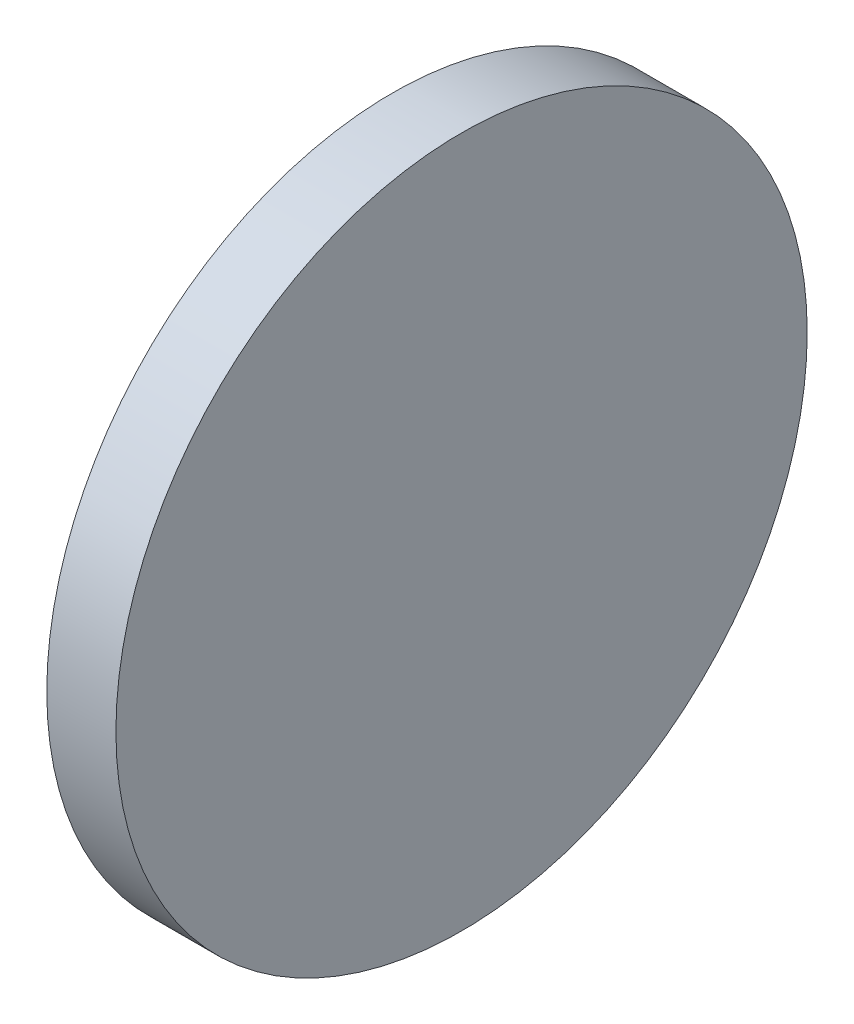
ISO-10303-21;
HEADER;
FILE_DESCRIPTION(('STEP AP214'),'2;1');
FILE_NAME('part.step','',(''),(''),'','','');
FILE_SCHEMA(('AUTOMOTIVE_DESIGN { 1 0 10303 214 1 1 1 1 }'));
ENDSEC;
DATA;
#1=APPLICATION_CONTEXT('core data for automotive mechanical design processes');
#2=APPLICATION_PROTOCOL_DEFINITION('international standard','automotive_design',2000,#1);
#3=PRODUCT_CONTEXT('',#1,'mechanical');
#4=PRODUCT('Part','Part','',(#3));
#5=PRODUCT_RELATED_PRODUCT_CATEGORY('part','',(#4));
#6=PRODUCT_DEFINITION_FORMATION('','',#4);
#7=PRODUCT_DEFINITION_CONTEXT('part definition',#1,'design');
#8=PRODUCT_DEFINITION('design','',#6,#7);
#9=PRODUCT_DEFINITION_SHAPE('','',#8);
#10=(LENGTH_UNIT() NAMED_UNIT(*) SI_UNIT(.MILLI.,.METRE.));
#11=(NAMED_UNIT(*) PLANE_ANGLE_UNIT() SI_UNIT($,.RADIAN.));
#12=(NAMED_UNIT(*) SI_UNIT($,.STERADIAN.) SOLID_ANGLE_UNIT());
#13=UNCERTAINTY_MEASURE_WITH_UNIT(LENGTH_MEASURE(1.E-05),#10,'distance_accuracy_value','');
#14=(GEOMETRIC_REPRESENTATION_CONTEXT(3) GLOBAL_UNCERTAINTY_ASSIGNED_CONTEXT((#13)) GLOBAL_UNIT_ASSIGNED_CONTEXT((#10,
#11,#12)) REPRESENTATION_CONTEXT('',''));
#15=CARTESIAN_POINT('',(0.,0.,0.));
#16=DIRECTION('',(0.,0.,1.));
#17=DIRECTION('',(1.,0.,0.));
#18=AXIS2_PLACEMENT_3D('',#15,#16,#17);
#19=CARTESIAN_POINT('',(1.5,0.,0.));
#20=DIRECTION('',(-1.,0.,0.));
#21=DIRECTION('',(0.,0.,1.));
#22=AXIS2_PLACEMENT_3D('',#19,#20,#21);
#23=CYLINDRICAL_SURFACE('',#22,7.5);
#24=CARTESIAN_POINT('',(1.5,0.,0.));
#25=DIRECTION('',(1.,0.,0.));
#26=DIRECTION('',(0.,0.,-1.));
#27=AXIS2_PLACEMENT_3D('',#24,#25,#26);
#28=CIRCLE('',#27,7.5);
#29=CARTESIAN_POINT('',(1.5,0.,-7.5));
#30=VERTEX_POINT('',#29);
#31=EDGE_CURVE('E10',#30,#30,#28,.T.);
#32=ORIENTED_EDGE('',*,*,#31,.F.);
#33=EDGE_LOOP('',(#32));
#34=FACE_BOUND('',#33,.T.);
#35=CARTESIAN_POINT('',(0.,0.,0.));
#36=DIRECTION('',(1.,0.,0.));
#37=DIRECTION('',(0.,0.,-1.));
#38=AXIS2_PLACEMENT_3D('',#35,#36,#37);
#39=CIRCLE('',#38,7.5);
#40=CARTESIAN_POINT('',(0.,0.,-7.5));
#41=VERTEX_POINT('',#40);
#42=EDGE_CURVE('E35',#41,#41,#39,.T.);
#43=ORIENTED_EDGE('',*,*,#42,.T.);
#44=EDGE_LOOP('',(#43));
#45=FACE_BOUND('',#44,.T.);
#46=ADVANCED_FACE('F32',(#34,#45),#23,.T.);
#47=CARTESIAN_POINT('',(1.5,0.,0.));
#48=DIRECTION('',(1.,0.,0.));
#49=DIRECTION('',(0.,0.,-1.));
#50=AXIS2_PLACEMENT_3D('',#47,#48,#49);
#51=PLANE('',#50);
#52=ORIENTED_EDGE('',*,*,#31,.T.);
#53=EDGE_LOOP('',(#52));
#54=FACE_BOUND('',#53,.T.);
#55=ADVANCED_FACE('F47',(#54),#51,.T.);
#56=CARTESIAN_POINT('',(0.,0.,0.));
#57=DIRECTION('',(1.,0.,0.));
#58=DIRECTION('',(0.,0.,-1.));
#59=AXIS2_PLACEMENT_3D('',#56,#57,#58);
#60=PLANE('',#59);
#61=ORIENTED_EDGE('',*,*,#42,.F.);
#62=EDGE_LOOP('',(#61));
#63=FACE_BOUND('',#62,.T.);
#64=ADVANCED_FACE('F45',(#63),#60,.F.);
#65=CLOSED_SHELL('',(#46,#55,#64));
#66=MANIFOLD_SOLID_BREP('B2',#65);
#67=ADVANCED_BREP_SHAPE_REPRESENTATION('',(#18,#66),#14);
#68=SHAPE_DEFINITION_REPRESENTATION(#9,#67);
ENDSEC;
END-ISO-10303-21;
